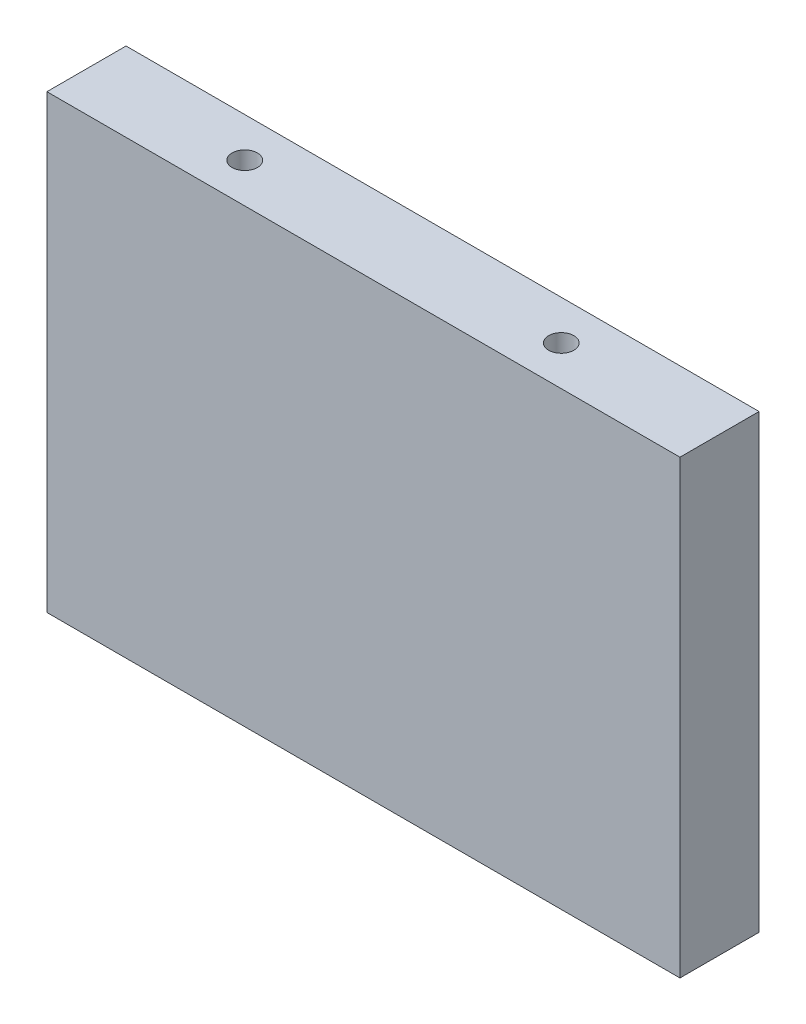
ISO-10303-21;
HEADER;
FILE_DESCRIPTION(('STEP AP214'),'2;1');
FILE_NAME('part.step','',(''),(''),'','','');
FILE_SCHEMA(('AUTOMOTIVE_DESIGN { 1 0 10303 214 1 1 1 1 }'));
ENDSEC;
DATA;
#1=APPLICATION_CONTEXT('core data for automotive mechanical design processes');
#2=APPLICATION_PROTOCOL_DEFINITION('international standard','automotive_design',2000,#1);
#3=PRODUCT_CONTEXT('',#1,'mechanical');
#4=PRODUCT('Part','Part','',(#3));
#5=PRODUCT_RELATED_PRODUCT_CATEGORY('part','',(#4));
#6=PRODUCT_DEFINITION_FORMATION('','',#4);
#7=PRODUCT_DEFINITION_CONTEXT('part definition',#1,'design');
#8=PRODUCT_DEFINITION('design','',#6,#7);
#9=PRODUCT_DEFINITION_SHAPE('','',#8);
#10=(LENGTH_UNIT() NAMED_UNIT(*) SI_UNIT(.MILLI.,.METRE.));
#11=(NAMED_UNIT(*) PLANE_ANGLE_UNIT() SI_UNIT($,.RADIAN.));
#12=(NAMED_UNIT(*) SI_UNIT($,.STERADIAN.) SOLID_ANGLE_UNIT());
#13=UNCERTAINTY_MEASURE_WITH_UNIT(LENGTH_MEASURE(1.E-05),#10,'distance_accuracy_value','');
#14=(GEOMETRIC_REPRESENTATION_CONTEXT(3) GLOBAL_UNCERTAINTY_ASSIGNED_CONTEXT((#13)) GLOBAL_UNIT_ASSIGNED_CONTEXT((#10,
#11,#12)) REPRESENTATION_CONTEXT('',''));
#15=CARTESIAN_POINT('',(0.,0.,0.));
#16=DIRECTION('',(0.,0.,1.));
#17=DIRECTION('',(1.,0.,0.));
#18=AXIS2_PLACEMENT_3D('',#15,#16,#17);
#19=CARTESIAN_POINT('',(20.,-14.25,5.));
#20=DIRECTION('',(-1.,0.,0.));
#21=DIRECTION('',(0.,0.,1.));
#22=AXIS2_PLACEMENT_3D('',#19,#20,#21);
#23=PLANE('',#22);
#24=DIRECTION('',(0.,1.,0.));
#25=VECTOR('',#24,1.);
#26=CARTESIAN_POINT('',(20.,-14.25,0.));
#27=LINE('',#26,#25);
#28=CARTESIAN_POINT('',(20.,-14.25,0.));
#29=VERTEX_POINT('',#28);
#30=CARTESIAN_POINT('',(20.,14.25,0.));
#31=VERTEX_POINT('',#30);
#32=EDGE_CURVE('E135',#29,#31,#27,.T.);
#33=ORIENTED_EDGE('',*,*,#32,.T.);
#34=DIRECTION('',(0.,0.,-1.));
#35=VECTOR('',#34,1.);
#36=CARTESIAN_POINT('',(20.,14.25,5.));
#37=LINE('',#36,#35);
#38=CARTESIAN_POINT('',(20.,14.25,5.));
#39=VERTEX_POINT('',#38);
#40=EDGE_CURVE('E11',#39,#31,#37,.T.);
#41=ORIENTED_EDGE('',*,*,#40,.F.);
#42=DIRECTION('',(0.,1.,0.));
#43=VECTOR('',#42,1.);
#44=CARTESIAN_POINT('',(20.,-14.25,5.));
#45=LINE('',#44,#43);
#46=CARTESIAN_POINT('',(20.,-14.25,5.));
#47=VERTEX_POINT('',#46);
#48=EDGE_CURVE('E136',#47,#39,#45,.T.);
#49=ORIENTED_EDGE('',*,*,#48,.F.);
#50=DIRECTION('',(0.,0.,-1.));
#51=VECTOR('',#50,1.);
#52=CARTESIAN_POINT('',(20.,-14.25,5.));
#53=LINE('',#52,#51);
#54=EDGE_CURVE('E142',#47,#29,#53,.T.);
#55=ORIENTED_EDGE('',*,*,#54,.T.);
#56=EDGE_LOOP('',(#33,#41,#49,#55));
#57=FACE_BOUND('',#56,.T.);
#58=ADVANCED_FACE('F42',(#57),#23,.F.);
#59=CARTESIAN_POINT('',(-20.,14.25,5.));
#60=DIRECTION('',(0.,-1.,0.));
#61=DIRECTION('',(0.,0.,-1.));
#62=AXIS2_PLACEMENT_3D('',#59,#60,#61);
#63=PLANE('',#62);
#64=CARTESIAN_POINT('',(-10.,14.25,2.5));
#65=DIRECTION('',(0.,1.,0.));
#66=DIRECTION('',(0.,0.,1.));
#67=AXIS2_PLACEMENT_3D('',#64,#65,#66);
#68=CIRCLE('',#67,0.79999999999999);
#69=CARTESIAN_POINT('',(-10.,14.25,3.29999999999999));
#70=VERTEX_POINT('',#69);
#71=EDGE_CURVE('E123',#70,#70,#68,.T.);
#72=ORIENTED_EDGE('',*,*,#71,.F.);
#73=EDGE_LOOP('',(#72));
#74=FACE_BOUND('',#73,.T.);
#75=CARTESIAN_POINT('',(10.,14.25,2.5));
#76=DIRECTION('',(0.,1.,0.));
#77=DIRECTION('',(0.,0.,1.));
#78=AXIS2_PLACEMENT_3D('',#75,#76,#77);
#79=CIRCLE('',#78,0.79999999999999);
#80=CARTESIAN_POINT('',(10.,14.25,3.29999999999999));
#81=VERTEX_POINT('',#80);
#82=EDGE_CURVE('E129',#81,#81,#79,.T.);
#83=ORIENTED_EDGE('',*,*,#82,.F.);
#84=EDGE_LOOP('',(#83));
#85=FACE_BOUND('',#84,.T.);
#86=DIRECTION('',(-1.,0.,0.));
#87=VECTOR('',#86,1.);
#88=CARTESIAN_POINT('',(-20.,14.25,0.));
#89=LINE('',#88,#87);
#90=CARTESIAN_POINT('',(-20.,14.25,0.));
#91=VERTEX_POINT('',#90);
#92=EDGE_CURVE('E145',#31,#91,#89,.T.);
#93=ORIENTED_EDGE('',*,*,#92,.T.);
#94=DIRECTION('',(0.,0.,-1.));
#95=VECTOR('',#94,1.);
#96=CARTESIAN_POINT('',(-20.,14.25,5.));
#97=LINE('',#96,#95);
#98=CARTESIAN_POINT('',(-20.,14.25,5.));
#99=VERTEX_POINT('',#98);
#100=EDGE_CURVE('E50',#99,#91,#97,.T.);
#101=ORIENTED_EDGE('',*,*,#100,.F.);
#102=DIRECTION('',(-1.,0.,0.));
#103=VECTOR('',#102,1.);
#104=CARTESIAN_POINT('',(-20.,14.25,5.));
#105=LINE('',#104,#103);
#106=EDGE_CURVE('E89',#39,#99,#105,.T.);
#107=ORIENTED_EDGE('',*,*,#106,.F.);
#108=ORIENTED_EDGE('',*,*,#40,.T.);
#109=EDGE_LOOP('',(#93,#101,#107,#108));
#110=FACE_BOUND('',#109,.T.);
#111=ADVANCED_FACE('F169',(#74,#85,#110),#63,.F.);
#112=CARTESIAN_POINT('',(-20.,-14.25,5.));
#113=DIRECTION('',(1.,0.,0.));
#114=DIRECTION('',(0.,0.,-1.));
#115=AXIS2_PLACEMENT_3D('',#112,#113,#114);
#116=PLANE('',#115);
#117=DIRECTION('',(0.,-1.,0.));
#118=VECTOR('',#117,1.);
#119=CARTESIAN_POINT('',(-20.,-14.25,0.));
#120=LINE('',#119,#118);
#121=CARTESIAN_POINT('',(-20.,-14.25,0.));
#122=VERTEX_POINT('',#121);
#123=EDGE_CURVE('E76',#91,#122,#120,.T.);
#124=ORIENTED_EDGE('',*,*,#123,.T.);
#125=DIRECTION('',(0.,0.,-1.));
#126=VECTOR('',#125,1.);
#127=CARTESIAN_POINT('',(-20.,-14.25,5.));
#128=LINE('',#127,#126);
#129=CARTESIAN_POINT('',(-20.,-14.25,5.));
#130=VERTEX_POINT('',#129);
#131=EDGE_CURVE('E150',#130,#122,#128,.T.);
#132=ORIENTED_EDGE('',*,*,#131,.F.);
#133=DIRECTION('',(0.,-1.,0.));
#134=VECTOR('',#133,1.);
#135=CARTESIAN_POINT('',(-20.,-14.25,5.));
#136=LINE('',#135,#134);
#137=EDGE_CURVE('E139',#99,#130,#136,.T.);
#138=ORIENTED_EDGE('',*,*,#137,.F.);
#139=ORIENTED_EDGE('',*,*,#100,.T.);
#140=EDGE_LOOP('',(#124,#132,#138,#139));
#141=FACE_BOUND('',#140,.T.);
#142=ADVANCED_FACE('F152',(#141),#116,.F.);
#143=CARTESIAN_POINT('',(-20.,-14.25,5.));
#144=DIRECTION('',(0.,1.,0.));
#145=DIRECTION('',(0.,0.,1.));
#146=AXIS2_PLACEMENT_3D('',#143,#144,#145);
#147=PLANE('',#146);
#148=CARTESIAN_POINT('',(-10.,-14.25,2.5));
#149=DIRECTION('',(0.,-1.,0.));
#150=DIRECTION('',(0.,0.,-1.));
#151=AXIS2_PLACEMENT_3D('',#148,#149,#150);
#152=CIRCLE('',#151,0.79999999999999);
#153=CARTESIAN_POINT('',(-10.,-14.25,1.70000000000001));
#154=VERTEX_POINT('',#153);
#155=EDGE_CURVE('E113',#154,#154,#152,.T.);
#156=ORIENTED_EDGE('',*,*,#155,.F.);
#157=EDGE_LOOP('',(#156));
#158=FACE_BOUND('',#157,.T.);
#159=CARTESIAN_POINT('',(10.,-14.25,2.5));
#160=DIRECTION('',(0.,-1.,0.));
#161=DIRECTION('',(0.,0.,-1.));
#162=AXIS2_PLACEMENT_3D('',#159,#160,#161);
#163=CIRCLE('',#162,0.79999999999999);
#164=CARTESIAN_POINT('',(10.,-14.25,1.70000000000001));
#165=VERTEX_POINT('',#164);
#166=EDGE_CURVE('E112',#165,#165,#163,.T.);
#167=ORIENTED_EDGE('',*,*,#166,.F.);
#168=EDGE_LOOP('',(#167));
#169=FACE_BOUND('',#168,.T.);
#170=DIRECTION('',(1.,0.,0.));
#171=VECTOR('',#170,1.);
#172=CARTESIAN_POINT('',(-20.,-14.25,0.));
#173=LINE('',#172,#171);
#174=EDGE_CURVE('E82',#122,#29,#173,.T.);
#175=ORIENTED_EDGE('',*,*,#174,.T.);
#176=ORIENTED_EDGE('',*,*,#54,.F.);
#177=DIRECTION('',(1.,0.,0.));
#178=VECTOR('',#177,1.);
#179=CARTESIAN_POINT('',(-20.,-14.25,5.));
#180=LINE('',#179,#178);
#181=EDGE_CURVE('E58',#130,#47,#180,.T.);
#182=ORIENTED_EDGE('',*,*,#181,.F.);
#183=ORIENTED_EDGE('',*,*,#131,.T.);
#184=EDGE_LOOP('',(#175,#176,#182,#183));
#185=FACE_BOUND('',#184,.T.);
#186=ADVANCED_FACE('F159',(#158,#169,#185),#147,.F.);
#187=CARTESIAN_POINT('',(0.,0.,5.));
#188=DIRECTION('',(0.,0.,-1.));
#189=DIRECTION('',(-1.,0.,0.));
#190=AXIS2_PLACEMENT_3D('',#187,#188,#189);
#191=PLANE('',#190);
#192=ORIENTED_EDGE('',*,*,#48,.T.);
#193=ORIENTED_EDGE('',*,*,#106,.T.);
#194=ORIENTED_EDGE('',*,*,#137,.T.);
#195=ORIENTED_EDGE('',*,*,#181,.T.);
#196=EDGE_LOOP('',(#192,#193,#194,#195));
#197=FACE_BOUND('',#196,.T.);
#198=ADVANCED_FACE('F161',(#197),#191,.F.);
#199=CARTESIAN_POINT('',(0.,0.,0.));
#200=DIRECTION('',(0.,0.,-1.));
#201=DIRECTION('',(-1.,0.,0.));
#202=AXIS2_PLACEMENT_3D('',#199,#200,#201);
#203=PLANE('',#202);
#204=ORIENTED_EDGE('',*,*,#32,.F.);
#205=ORIENTED_EDGE('',*,*,#174,.F.);
#206=ORIENTED_EDGE('',*,*,#123,.F.);
#207=ORIENTED_EDGE('',*,*,#92,.F.);
#208=EDGE_LOOP('',(#204,#205,#206,#207));
#209=FACE_BOUND('',#208,.T.);
#210=ADVANCED_FACE('F155',(#209),#203,.T.);
#211=CARTESIAN_POINT('',(10.,9.25,2.5));
#212=DIRECTION('',(0.,1.,0.));
#213=DIRECTION('',(0.,0.,1.));
#214=AXIS2_PLACEMENT_3D('',#211,#212,#213);
#215=CONICAL_SURFACE('',#214,0.799999999999988,1.02974425867665);
#216=CARTESIAN_POINT('',(10.,8.76931150477795,2.5));
#217=VERTEX_POINT('',#216);
#218=VERTEX_LOOP('',#217);
#219=FACE_BOUND('',#218,.T.);
#220=CARTESIAN_POINT('',(10.,9.25,2.5));
#221=DIRECTION('',(0.,1.,0.));
#222=DIRECTION('',(0.,0.,1.));
#223=AXIS2_PLACEMENT_3D('',#220,#221,#222);
#224=CIRCLE('',#223,0.799999999999988);
#225=CARTESIAN_POINT('',(10.,9.25,3.29999999999999));
#226=VERTEX_POINT('',#225);
#227=EDGE_CURVE('E132',#226,#226,#224,.T.);
#228=ORIENTED_EDGE('',*,*,#227,.T.);
#229=EDGE_LOOP('',(#228));
#230=FACE_BOUND('',#229,.T.);
#231=ADVANCED_FACE('F188',(#219,#230),#215,.F.);
#232=CARTESIAN_POINT('',(10.,14.25,2.5));
#233=DIRECTION('',(0.,1.,0.));
#234=DIRECTION('',(0.,0.,1.));
#235=AXIS2_PLACEMENT_3D('',#232,#233,#234);
#236=CYLINDRICAL_SURFACE('',#235,0.799999999999989);
#237=ORIENTED_EDGE('',*,*,#227,.F.);
#238=EDGE_LOOP('',(#237));
#239=FACE_BOUND('',#238,.T.);
#240=ORIENTED_EDGE('',*,*,#82,.T.);
#241=EDGE_LOOP('',(#240));
#242=FACE_BOUND('',#241,.T.);
#243=ADVANCED_FACE('F185',(#239,#242),#236,.F.);
#244=CARTESIAN_POINT('',(-10.,9.25,2.5));
#245=DIRECTION('',(0.,1.,0.));
#246=DIRECTION('',(0.,0.,1.));
#247=AXIS2_PLACEMENT_3D('',#244,#245,#246);
#248=CONICAL_SURFACE('',#247,0.799999999999988,1.02974425867665);
#249=CARTESIAN_POINT('',(-10.,8.76931150477795,2.5));
#250=VERTEX_POINT('',#249);
#251=VERTEX_LOOP('',#250);
#252=FACE_BOUND('',#251,.T.);
#253=CARTESIAN_POINT('',(-10.,9.25,2.5));
#254=DIRECTION('',(0.,1.,0.));
#255=DIRECTION('',(0.,0.,1.));
#256=AXIS2_PLACEMENT_3D('',#253,#254,#255);
#257=CIRCLE('',#256,0.799999999999988);
#258=CARTESIAN_POINT('',(-10.,9.25,3.29999999999999));
#259=VERTEX_POINT('',#258);
#260=EDGE_CURVE('E126',#259,#259,#257,.T.);
#261=ORIENTED_EDGE('',*,*,#260,.T.);
#262=EDGE_LOOP('',(#261));
#263=FACE_BOUND('',#262,.T.);
#264=ADVANCED_FACE('F187',(#252,#263),#248,.F.);
#265=CARTESIAN_POINT('',(-10.,14.25,2.5));
#266=DIRECTION('',(0.,1.,0.));
#267=DIRECTION('',(0.,0.,1.));
#268=AXIS2_PLACEMENT_3D('',#265,#266,#267);
#269=CYLINDRICAL_SURFACE('',#268,0.799999999999989);
#270=ORIENTED_EDGE('',*,*,#260,.F.);
#271=EDGE_LOOP('',(#270));
#272=FACE_BOUND('',#271,.T.);
#273=ORIENTED_EDGE('',*,*,#71,.T.);
#274=EDGE_LOOP('',(#273));
#275=FACE_BOUND('',#274,.T.);
#276=ADVANCED_FACE('F195',(#272,#275),#269,.F.);
#277=CARTESIAN_POINT('',(10.,-9.25,2.5));
#278=DIRECTION('',(0.,-1.,0.));
#279=DIRECTION('',(0.,0.,-1.));
#280=AXIS2_PLACEMENT_3D('',#277,#278,#279);
#281=CONICAL_SURFACE('',#280,0.799999999999988,1.02974425867665);
#282=CARTESIAN_POINT('',(10.,-8.76931150477795,2.5));
#283=VERTEX_POINT('',#282);
#284=VERTEX_LOOP('',#283);
#285=FACE_BOUND('',#284,.T.);
#286=CARTESIAN_POINT('',(10.,-9.25,2.5));
#287=DIRECTION('',(0.,-1.,0.));
#288=DIRECTION('',(0.,0.,-1.));
#289=AXIS2_PLACEMENT_3D('',#286,#287,#288);
#290=CIRCLE('',#289,0.799999999999988);
#291=CARTESIAN_POINT('',(10.,-9.25,1.70000000000001));
#292=VERTEX_POINT('',#291);
#293=EDGE_CURVE('E116',#292,#292,#290,.T.);
#294=ORIENTED_EDGE('',*,*,#293,.T.);
#295=EDGE_LOOP('',(#294));
#296=FACE_BOUND('',#295,.T.);
#297=ADVANCED_FACE('F239',(#285,#296),#281,.F.);
#298=CARTESIAN_POINT('',(10.,-14.25,2.5));
#299=DIRECTION('',(0.,-1.,0.));
#300=DIRECTION('',(0.,0.,-1.));
#301=AXIS2_PLACEMENT_3D('',#298,#299,#300);
#302=CYLINDRICAL_SURFACE('',#301,0.799999999999989);
#303=ORIENTED_EDGE('',*,*,#293,.F.);
#304=EDGE_LOOP('',(#303));
#305=FACE_BOUND('',#304,.T.);
#306=ORIENTED_EDGE('',*,*,#166,.T.);
#307=EDGE_LOOP('',(#306));
#308=FACE_BOUND('',#307,.T.);
#309=ADVANCED_FACE('F106',(#305,#308),#302,.F.);
#310=CARTESIAN_POINT('',(-10.,-9.25,2.5));
#311=DIRECTION('',(0.,-1.,0.));
#312=DIRECTION('',(0.,0.,-1.));
#313=AXIS2_PLACEMENT_3D('',#310,#311,#312);
#314=CONICAL_SURFACE('',#313,0.799999999999988,1.02974425867665);
#315=CARTESIAN_POINT('',(-10.,-8.76931150477795,2.5));
#316=VERTEX_POINT('',#315);
#317=VERTEX_LOOP('',#316);
#318=FACE_BOUND('',#317,.T.);
#319=CARTESIAN_POINT('',(-10.,-9.25,2.5));
#320=DIRECTION('',(0.,-1.,0.));
#321=DIRECTION('',(0.,0.,-1.));
#322=AXIS2_PLACEMENT_3D('',#319,#320,#321);
#323=CIRCLE('',#322,0.799999999999988);
#324=CARTESIAN_POINT('',(-10.,-9.25,1.70000000000001));
#325=VERTEX_POINT('',#324);
#326=EDGE_CURVE('E110',#325,#325,#323,.T.);
#327=ORIENTED_EDGE('',*,*,#326,.T.);
#328=EDGE_LOOP('',(#327));
#329=FACE_BOUND('',#328,.T.);
#330=ADVANCED_FACE('F102',(#318,#329),#314,.F.);
#331=CARTESIAN_POINT('',(-10.,-14.25,2.5));
#332=DIRECTION('',(0.,-1.,0.));
#333=DIRECTION('',(0.,0.,-1.));
#334=AXIS2_PLACEMENT_3D('',#331,#332,#333);
#335=CYLINDRICAL_SURFACE('',#334,0.799999999999989);
#336=ORIENTED_EDGE('',*,*,#326,.F.);
#337=EDGE_LOOP('',(#336));
#338=FACE_BOUND('',#337,.T.);
#339=ORIENTED_EDGE('',*,*,#155,.T.);
#340=EDGE_LOOP('',(#339));
#341=FACE_BOUND('',#340,.T.);
#342=ADVANCED_FACE('F105',(#338,#341),#335,.F.);
#343=CLOSED_SHELL('',(#58,#111,#142,#186,#198,#210,#231,#243,#264,#276,#297,#309,#330,#342));
#344=MANIFOLD_SOLID_BREP('B2',#343);
#345=ADVANCED_BREP_SHAPE_REPRESENTATION('',(#18,#344),#14);
#346=SHAPE_DEFINITION_REPRESENTATION(#9,#345);
ENDSEC;
END-ISO-10303-21;
